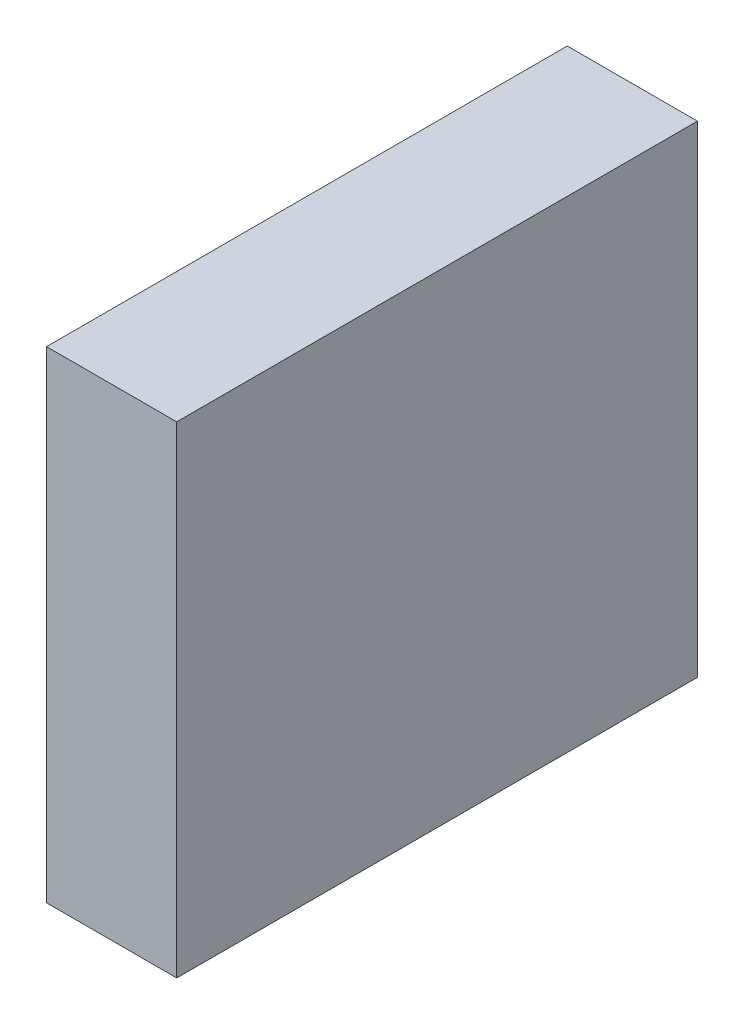
ISO-10303-21;
HEADER;
FILE_DESCRIPTION(('STEP AP214'),'2;1');
FILE_NAME('part.step','',(''),(''),'','','');
FILE_SCHEMA(('AUTOMOTIVE_DESIGN { 1 0 10303 214 1 1 1 1 }'));
ENDSEC;
DATA;
#1=APPLICATION_CONTEXT('core data for automotive mechanical design processes');
#2=APPLICATION_PROTOCOL_DEFINITION('international standard','automotive_design',2000,#1);
#3=PRODUCT_CONTEXT('',#1,'mechanical');
#4=PRODUCT('Part','Part','',(#3));
#5=PRODUCT_RELATED_PRODUCT_CATEGORY('part','',(#4));
#6=PRODUCT_DEFINITION_FORMATION('','',#4);
#7=PRODUCT_DEFINITION_CONTEXT('part definition',#1,'design');
#8=PRODUCT_DEFINITION('design','',#6,#7);
#9=PRODUCT_DEFINITION_SHAPE('','',#8);
#10=(LENGTH_UNIT() NAMED_UNIT(*) SI_UNIT(.MILLI.,.METRE.));
#11=(NAMED_UNIT(*) PLANE_ANGLE_UNIT() SI_UNIT($,.RADIAN.));
#12=(NAMED_UNIT(*) SI_UNIT($,.STERADIAN.) SOLID_ANGLE_UNIT());
#13=UNCERTAINTY_MEASURE_WITH_UNIT(LENGTH_MEASURE(1.E-05),#10,'distance_accuracy_value','');
#14=(GEOMETRIC_REPRESENTATION_CONTEXT(3) GLOBAL_UNCERTAINTY_ASSIGNED_CONTEXT((#13)) GLOBAL_UNIT_ASSIGNED_CONTEXT((#10,
#11,#12)) REPRESENTATION_CONTEXT('',''));
#15=CARTESIAN_POINT('',(0.,0.,0.));
#16=DIRECTION('',(0.,0.,1.));
#17=DIRECTION('',(1.,0.,0.));
#18=AXIS2_PLACEMENT_3D('',#15,#16,#17);
#19=CARTESIAN_POINT('',(-10.,0.,0.));
#20=DIRECTION('',(0.,0.,1.));
#21=DIRECTION('',(1.,0.,0.));
#22=AXIS2_PLACEMENT_3D('',#19,#20,#21);
#23=PLANE('',#22);
#24=DIRECTION('',(0.,-1.,0.));
#25=VECTOR('',#24,1.);
#26=CARTESIAN_POINT('',(0.,0.,0.));
#27=LINE('',#26,#25);
#28=CARTESIAN_POINT('',(0.,37.,0.));
#29=VERTEX_POINT('',#28);
#30=CARTESIAN_POINT('',(0.,0.,0.));
#31=VERTEX_POINT('',#30);
#32=EDGE_CURVE('E104',#29,#31,#27,.T.);
#33=ORIENTED_EDGE('',*,*,#32,.F.);
#34=DIRECTION('',(1.,0.,0.));
#35=VECTOR('',#34,1.);
#36=CARTESIAN_POINT('',(-10.,37.,0.));
#37=LINE('',#36,#35);
#38=CARTESIAN_POINT('',(-10.,37.,0.));
#39=VERTEX_POINT('',#38);
#40=EDGE_CURVE('E11',#39,#29,#37,.T.);
#41=ORIENTED_EDGE('',*,*,#40,.F.);
#42=DIRECTION('',(0.,-1.,0.));
#43=VECTOR('',#42,1.);
#44=CARTESIAN_POINT('',(-10.,0.,0.));
#45=LINE('',#44,#43);
#46=CARTESIAN_POINT('',(-10.,0.,0.));
#47=VERTEX_POINT('',#46);
#48=EDGE_CURVE('E100',#39,#47,#45,.T.);
#49=ORIENTED_EDGE('',*,*,#48,.T.);
#50=DIRECTION('',(1.,0.,0.));
#51=VECTOR('',#50,1.);
#52=CARTESIAN_POINT('',(-10.,0.,0.));
#53=LINE('',#52,#51);
#54=EDGE_CURVE('E45',#47,#31,#53,.T.);
#55=ORIENTED_EDGE('',*,*,#54,.T.);
#56=EDGE_LOOP('',(#33,#41,#49,#55));
#57=FACE_BOUND('',#56,.T.);
#58=ADVANCED_FACE('F39',(#57),#23,.T.);
#59=CARTESIAN_POINT('',(-10.,37.,0.));
#60=DIRECTION('',(0.,1.,0.));
#61=DIRECTION('',(0.,0.,1.));
#62=AXIS2_PLACEMENT_3D('',#59,#60,#61);
#63=PLANE('',#62);
#64=DIRECTION('',(0.,0.,1.));
#65=VECTOR('',#64,1.);
#66=CARTESIAN_POINT('',(0.,37.,0.));
#67=LINE('',#66,#65);
#68=CARTESIAN_POINT('',(0.,37.,-40.));
#69=VERTEX_POINT('',#68);
#70=EDGE_CURVE('E98',#69,#29,#67,.T.);
#71=ORIENTED_EDGE('',*,*,#70,.F.);
#72=DIRECTION('',(1.,0.,0.));
#73=VECTOR('',#72,1.);
#74=CARTESIAN_POINT('',(-10.,37.,-40.));
#75=LINE('',#74,#73);
#76=CARTESIAN_POINT('',(-10.,37.,-40.));
#77=VERTEX_POINT('',#76);
#78=EDGE_CURVE('E48',#77,#69,#75,.T.);
#79=ORIENTED_EDGE('',*,*,#78,.F.);
#80=DIRECTION('',(0.,0.,1.));
#81=VECTOR('',#80,1.);
#82=CARTESIAN_POINT('',(-10.,37.,0.));
#83=LINE('',#82,#81);
#84=EDGE_CURVE('E92',#77,#39,#83,.T.);
#85=ORIENTED_EDGE('',*,*,#84,.T.);
#86=ORIENTED_EDGE('',*,*,#40,.T.);
#87=EDGE_LOOP('',(#71,#79,#85,#86));
#88=FACE_BOUND('',#87,.T.);
#89=ADVANCED_FACE('F111',(#88),#63,.T.);
#90=CARTESIAN_POINT('',(-10.,0.,-40.));
#91=DIRECTION('',(0.,0.,-1.));
#92=DIRECTION('',(-1.,0.,0.));
#93=AXIS2_PLACEMENT_3D('',#90,#91,#92);
#94=PLANE('',#93);
#95=DIRECTION('',(0.,1.,0.));
#96=VECTOR('',#95,1.);
#97=CARTESIAN_POINT('',(0.,0.,-40.));
#98=LINE('',#97,#96);
#99=CARTESIAN_POINT('',(0.,0.,-40.));
#100=VERTEX_POINT('',#99);
#101=EDGE_CURVE('E87',#100,#69,#98,.T.);
#102=ORIENTED_EDGE('',*,*,#101,.F.);
#103=DIRECTION('',(1.,0.,0.));
#104=VECTOR('',#103,1.);
#105=CARTESIAN_POINT('',(-10.,0.,-40.));
#106=LINE('',#105,#104);
#107=CARTESIAN_POINT('',(-10.,0.,-40.));
#108=VERTEX_POINT('',#107);
#109=EDGE_CURVE('E84',#108,#100,#106,.T.);
#110=ORIENTED_EDGE('',*,*,#109,.F.);
#111=DIRECTION('',(0.,1.,0.));
#112=VECTOR('',#111,1.);
#113=CARTESIAN_POINT('',(-10.,0.,-40.));
#114=LINE('',#113,#112);
#115=EDGE_CURVE('E90',#108,#77,#114,.T.);
#116=ORIENTED_EDGE('',*,*,#115,.T.);
#117=ORIENTED_EDGE('',*,*,#78,.T.);
#118=EDGE_LOOP('',(#102,#110,#116,#117));
#119=FACE_BOUND('',#118,.T.);
#120=ADVANCED_FACE('F86',(#119),#94,.T.);
#121=CARTESIAN_POINT('',(-10.,0.,0.));
#122=DIRECTION('',(0.,-1.,0.));
#123=DIRECTION('',(0.,0.,-1.));
#124=AXIS2_PLACEMENT_3D('',#121,#122,#123);
#125=PLANE('',#124);
#126=DIRECTION('',(0.,0.,-1.));
#127=VECTOR('',#126,1.);
#128=CARTESIAN_POINT('',(0.,0.,0.));
#129=LINE('',#128,#127);
#130=EDGE_CURVE('E106',#31,#100,#129,.T.);
#131=ORIENTED_EDGE('',*,*,#130,.F.);
#132=ORIENTED_EDGE('',*,*,#54,.F.);
#133=DIRECTION('',(0.,0.,-1.));
#134=VECTOR('',#133,1.);
#135=CARTESIAN_POINT('',(-10.,0.,0.));
#136=LINE('',#135,#134);
#137=EDGE_CURVE('E93',#47,#108,#136,.T.);
#138=ORIENTED_EDGE('',*,*,#137,.T.);
#139=ORIENTED_EDGE('',*,*,#109,.T.);
#140=EDGE_LOOP('',(#131,#132,#138,#139));
#141=FACE_BOUND('',#140,.T.);
#142=ADVANCED_FACE('F96',(#141),#125,.T.);
#143=CARTESIAN_POINT('',(-10.,0.,0.));
#144=DIRECTION('',(-1.,0.,0.));
#145=DIRECTION('',(0.,0.,1.));
#146=AXIS2_PLACEMENT_3D('',#143,#144,#145);
#147=PLANE('',#146);
#148=ORIENTED_EDGE('',*,*,#48,.F.);
#149=ORIENTED_EDGE('',*,*,#84,.F.);
#150=ORIENTED_EDGE('',*,*,#115,.F.);
#151=ORIENTED_EDGE('',*,*,#137,.F.);
#152=EDGE_LOOP('',(#148,#149,#150,#151));
#153=FACE_BOUND('',#152,.T.);
#154=ADVANCED_FACE('F95',(#153),#147,.T.);
#155=CARTESIAN_POINT('',(0.,0.,0.));
#156=DIRECTION('',(-1.,0.,0.));
#157=DIRECTION('',(0.,0.,1.));
#158=AXIS2_PLACEMENT_3D('',#155,#156,#157);
#159=PLANE('',#158);
#160=ORIENTED_EDGE('',*,*,#32,.T.);
#161=ORIENTED_EDGE('',*,*,#130,.T.);
#162=ORIENTED_EDGE('',*,*,#101,.T.);
#163=ORIENTED_EDGE('',*,*,#70,.T.);
#164=EDGE_LOOP('',(#160,#161,#162,#163));
#165=FACE_BOUND('',#164,.T.);
#166=ADVANCED_FACE('F115',(#165),#159,.F.);
#167=CLOSED_SHELL('',(#58,#89,#120,#142,#154,#166));
#168=MANIFOLD_SOLID_BREP('B2',#167);
#169=ADVANCED_BREP_SHAPE_REPRESENTATION('',(#18,#168),#14);
#170=SHAPE_DEFINITION_REPRESENTATION(#9,#169);
ENDSEC;
END-ISO-10303-21;
